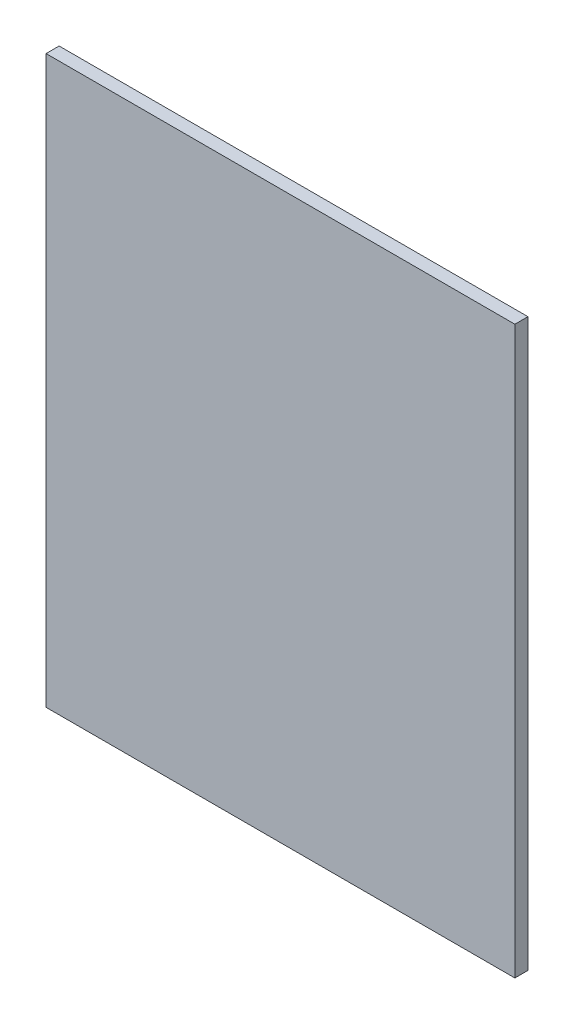
ISO-10303-21;
HEADER;
FILE_DESCRIPTION(('STEP AP214'),'2;1');
FILE_NAME('part.step','',(''),(''),'','','');
FILE_SCHEMA(('AUTOMOTIVE_DESIGN { 1 0 10303 214 1 1 1 1 }'));
ENDSEC;
DATA;
#1=APPLICATION_CONTEXT('core data for automotive mechanical design processes');
#2=APPLICATION_PROTOCOL_DEFINITION('international standard','automotive_design',2000,#1);
#3=PRODUCT_CONTEXT('',#1,'mechanical');
#4=PRODUCT('Part','Part','',(#3));
#5=PRODUCT_RELATED_PRODUCT_CATEGORY('part','',(#4));
#6=PRODUCT_DEFINITION_FORMATION('','',#4);
#7=PRODUCT_DEFINITION_CONTEXT('part definition',#1,'design');
#8=PRODUCT_DEFINITION('design','',#6,#7);
#9=PRODUCT_DEFINITION_SHAPE('','',#8);
#10=(LENGTH_UNIT() NAMED_UNIT(*) SI_UNIT(.MILLI.,.METRE.));
#11=(NAMED_UNIT(*) PLANE_ANGLE_UNIT() SI_UNIT($,.RADIAN.));
#12=(NAMED_UNIT(*) SI_UNIT($,.STERADIAN.) SOLID_ANGLE_UNIT());
#13=UNCERTAINTY_MEASURE_WITH_UNIT(LENGTH_MEASURE(1.E-05),#10,'distance_accuracy_value','');
#14=(GEOMETRIC_REPRESENTATION_CONTEXT(3) GLOBAL_UNCERTAINTY_ASSIGNED_CONTEXT((#13)) GLOBAL_UNIT_ASSIGNED_CONTEXT((#10,
#11,#12)) REPRESENTATION_CONTEXT('',''));
#15=CARTESIAN_POINT('',(0.,0.,0.));
#16=DIRECTION('',(0.,0.,1.));
#17=DIRECTION('',(1.,0.,0.));
#18=AXIS2_PLACEMENT_3D('',#15,#16,#17);
#19=CARTESIAN_POINT('',(-2.1499957,2.59662676,0.11999976));
#20=DIRECTION('',(0.,0.,-1.));
#21=DIRECTION('',(-1.,0.,0.));
#22=AXIS2_PLACEMENT_3D('',#19,#20,#21);
#23=PLANE('',#22);
#24=DIRECTION('',(0.,1.,0.));
#25=VECTOR('',#24,1.);
#26=CARTESIAN_POINT('',(2.1499957,-2.59662676,0.11999976));
#27=LINE('',#26,#25);
#28=CARTESIAN_POINT('',(2.1499957,-2.59662676,0.11999976));
#29=VERTEX_POINT('',#28);
#30=CARTESIAN_POINT('',(2.1499957,2.59662676,0.11999976));
#31=VERTEX_POINT('',#30);
#32=EDGE_CURVE('E80',#29,#31,#27,.T.);
#33=ORIENTED_EDGE('',*,*,#32,.T.);
#34=DIRECTION('',(1.,0.,0.));
#35=VECTOR('',#34,1.);
#36=CARTESIAN_POINT('',(2.1499957,2.59662676,0.11999976));
#37=LINE('',#36,#35);
#38=CARTESIAN_POINT('',(-2.1499957,2.59662676,0.11999976));
#39=VERTEX_POINT('',#38);
#40=EDGE_CURVE('E55',#31,#39,#37,.F.);
#41=ORIENTED_EDGE('',*,*,#40,.T.);
#42=DIRECTION('',(0.,1.,0.));
#43=VECTOR('',#42,1.);
#44=CARTESIAN_POINT('',(-2.1499957,2.59662676,0.11999976));
#45=LINE('',#44,#43);
#46=CARTESIAN_POINT('',(-2.1499957,-2.59662676,0.11999976));
#47=VERTEX_POINT('',#46);
#48=EDGE_CURVE('E57',#39,#47,#45,.F.);
#49=ORIENTED_EDGE('',*,*,#48,.T.);
#50=DIRECTION('',(1.,0.,0.));
#51=VECTOR('',#50,1.);
#52=CARTESIAN_POINT('',(-2.1499957,-2.59662676,0.11999976));
#53=LINE('',#52,#51);
#54=EDGE_CURVE('E20',#47,#29,#53,.T.);
#55=ORIENTED_EDGE('',*,*,#54,.T.);
#56=EDGE_LOOP('',(#33,#41,#49,#55));
#57=FACE_BOUND('',#56,.T.);
#58=ADVANCED_FACE('F17',(#57),#23,.F.);
#59=CARTESIAN_POINT('',(-2.1499957,-2.59662676,0.));
#60=DIRECTION('',(0.,1.,0.));
#61=DIRECTION('',(0.,0.,1.));
#62=AXIS2_PLACEMENT_3D('',#59,#60,#61);
#63=PLANE('',#62);
#64=ORIENTED_EDGE('',*,*,#54,.F.);
#65=DIRECTION('',(0.,0.,-1.));
#66=VECTOR('',#65,1.);
#67=CARTESIAN_POINT('',(-2.1499957,-2.59662676,0.));
#68=LINE('',#67,#66);
#69=CARTESIAN_POINT('',(-2.1499957,-2.59662676,0.));
#70=VERTEX_POINT('',#69);
#71=EDGE_CURVE('E63',#47,#70,#68,.T.);
#72=ORIENTED_EDGE('',*,*,#71,.T.);
#73=DIRECTION('',(-1.,0.,0.));
#74=VECTOR('',#73,1.);
#75=CARTESIAN_POINT('',(-2.1499957,-2.59662676,0.));
#76=LINE('',#75,#74);
#77=CARTESIAN_POINT('',(2.1499957,-2.59662676,0.));
#78=VERTEX_POINT('',#77);
#79=EDGE_CURVE('E83',#78,#70,#76,.T.);
#80=ORIENTED_EDGE('',*,*,#79,.F.);
#81=DIRECTION('',(0.,0.,1.));
#82=VECTOR('',#81,1.);
#83=CARTESIAN_POINT('',(2.1499957,-2.59662676,0.));
#84=LINE('',#83,#82);
#85=EDGE_CURVE('E68',#78,#29,#84,.T.);
#86=ORIENTED_EDGE('',*,*,#85,.T.);
#87=EDGE_LOOP('',(#64,#72,#80,#86));
#88=FACE_BOUND('',#87,.T.);
#89=ADVANCED_FACE('F65',(#88),#63,.F.);
#90=CARTESIAN_POINT('',(-2.1499957,2.59662676,0.));
#91=DIRECTION('',(1.,0.,0.));
#92=DIRECTION('',(0.,0.,-1.));
#93=AXIS2_PLACEMENT_3D('',#90,#91,#92);
#94=PLANE('',#93);
#95=ORIENTED_EDGE('',*,*,#48,.F.);
#96=DIRECTION('',(0.,0.,-1.));
#97=VECTOR('',#96,1.);
#98=CARTESIAN_POINT('',(-2.1499957,2.59662676,0.));
#99=LINE('',#98,#97);
#100=CARTESIAN_POINT('',(-2.1499957,2.59662676,0.));
#101=VERTEX_POINT('',#100);
#102=EDGE_CURVE('E75',#39,#101,#99,.T.);
#103=ORIENTED_EDGE('',*,*,#102,.T.);
#104=DIRECTION('',(0.,1.,0.));
#105=VECTOR('',#104,1.);
#106=CARTESIAN_POINT('',(-2.1499957,2.59662676,0.));
#107=LINE('',#106,#105);
#108=EDGE_CURVE('E72',#70,#101,#107,.T.);
#109=ORIENTED_EDGE('',*,*,#108,.F.);
#110=ORIENTED_EDGE('',*,*,#71,.F.);
#111=EDGE_LOOP('',(#95,#103,#109,#110));
#112=FACE_BOUND('',#111,.T.);
#113=ADVANCED_FACE('F70',(#112),#94,.F.);
#114=CARTESIAN_POINT('',(2.1499957,2.59662676,0.));
#115=DIRECTION('',(0.,-1.,0.));
#116=DIRECTION('',(0.,0.,-1.));
#117=AXIS2_PLACEMENT_3D('',#114,#115,#116);
#118=PLANE('',#117);
#119=ORIENTED_EDGE('',*,*,#40,.F.);
#120=DIRECTION('',(0.,0.,1.));
#121=VECTOR('',#120,1.);
#122=CARTESIAN_POINT('',(2.1499957,2.59662676,0.));
#123=LINE('',#122,#121);
#124=CARTESIAN_POINT('',(2.1499957,2.59662676,0.));
#125=VERTEX_POINT('',#124);
#126=EDGE_CURVE('E35',#31,#125,#123,.F.);
#127=ORIENTED_EDGE('',*,*,#126,.T.);
#128=DIRECTION('',(-1.,0.,0.));
#129=VECTOR('',#128,1.);
#130=CARTESIAN_POINT('',(-2.1499957,2.59662676,0.));
#131=LINE('',#130,#129);
#132=EDGE_CURVE('E26',#101,#125,#131,.F.);
#133=ORIENTED_EDGE('',*,*,#132,.F.);
#134=ORIENTED_EDGE('',*,*,#102,.F.);
#135=EDGE_LOOP('',(#119,#127,#133,#134));
#136=FACE_BOUND('',#135,.T.);
#137=ADVANCED_FACE('F89',(#136),#118,.F.);
#138=CARTESIAN_POINT('',(2.1499957,-2.59662676,0.));
#139=DIRECTION('',(-1.,0.,0.));
#140=DIRECTION('',(0.,0.,1.));
#141=AXIS2_PLACEMENT_3D('',#138,#139,#140);
#142=PLANE('',#141);
#143=ORIENTED_EDGE('',*,*,#32,.F.);
#144=ORIENTED_EDGE('',*,*,#85,.F.);
#145=DIRECTION('',(0.,1.,0.));
#146=VECTOR('',#145,1.);
#147=CARTESIAN_POINT('',(2.1499957,2.59662676,0.));
#148=LINE('',#147,#146);
#149=EDGE_CURVE('E11',#125,#78,#148,.F.);
#150=ORIENTED_EDGE('',*,*,#149,.F.);
#151=ORIENTED_EDGE('',*,*,#126,.F.);
#152=EDGE_LOOP('',(#143,#144,#150,#151));
#153=FACE_BOUND('',#152,.T.);
#154=ADVANCED_FACE('F91',(#153),#142,.F.);
#155=CARTESIAN_POINT('',(-2.1499957,2.59662676,0.));
#156=DIRECTION('',(0.,0.,-1.));
#157=DIRECTION('',(-1.,0.,0.));
#158=AXIS2_PLACEMENT_3D('',#155,#156,#157);
#159=PLANE('',#158);
#160=ORIENTED_EDGE('',*,*,#132,.T.);
#161=ORIENTED_EDGE('',*,*,#149,.T.);
#162=ORIENTED_EDGE('',*,*,#79,.T.);
#163=ORIENTED_EDGE('',*,*,#108,.T.);
#164=EDGE_LOOP('',(#160,#161,#162,#163));
#165=FACE_BOUND('',#164,.T.);
#166=ADVANCED_FACE('F88',(#165),#159,.T.);
#167=CLOSED_SHELL('',(#58,#89,#113,#137,#154,#166));
#168=MANIFOLD_SOLID_BREP('B1',#167);
#169=ADVANCED_BREP_SHAPE_REPRESENTATION('',(#18,#168),#14);
#170=SHAPE_DEFINITION_REPRESENTATION(#9,#169);
ENDSEC;
END-ISO-10303-21;
